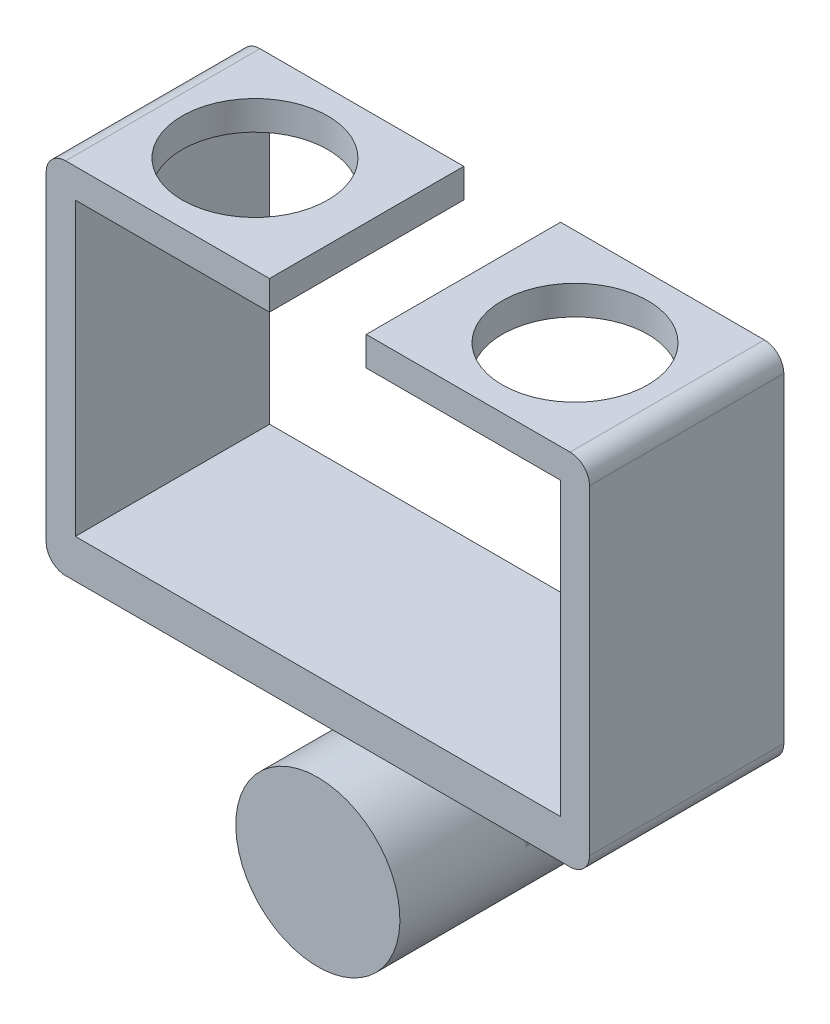
ISO-10303-21;
HEADER;
FILE_DESCRIPTION(('STEP AP214'),'2;1');
FILE_NAME('part.step','',(''),(''),'','','');
FILE_SCHEMA(('AUTOMOTIVE_DESIGN { 1 0 10303 214 1 1 1 1 }'));
ENDSEC;
DATA;
#1=APPLICATION_CONTEXT('core data for automotive mechanical design processes');
#2=APPLICATION_PROTOCOL_DEFINITION('international standard','automotive_design',2000,#1);
#3=PRODUCT_CONTEXT('',#1,'mechanical');
#4=PRODUCT('Part','Part','',(#3));
#5=PRODUCT_RELATED_PRODUCT_CATEGORY('part','',(#4));
#6=PRODUCT_DEFINITION_FORMATION('','',#4);
#7=PRODUCT_DEFINITION_CONTEXT('part definition',#1,'design');
#8=PRODUCT_DEFINITION('design','',#6,#7);
#9=PRODUCT_DEFINITION_SHAPE('','',#8);
#10=(LENGTH_UNIT() NAMED_UNIT(*) SI_UNIT(.MILLI.,.METRE.));
#11=(NAMED_UNIT(*) PLANE_ANGLE_UNIT() SI_UNIT($,.RADIAN.));
#12=(NAMED_UNIT(*) SI_UNIT($,.STERADIAN.) SOLID_ANGLE_UNIT());
#13=UNCERTAINTY_MEASURE_WITH_UNIT(LENGTH_MEASURE(1.E-05),#10,'distance_accuracy_value','');
#14=(GEOMETRIC_REPRESENTATION_CONTEXT(3) GLOBAL_UNCERTAINTY_ASSIGNED_CONTEXT((#13)) GLOBAL_UNIT_ASSIGNED_CONTEXT((#10,
#11,#12)) REPRESENTATION_CONTEXT('',''));
#15=CARTESIAN_POINT('',(0.,0.,0.));
#16=DIRECTION('',(0.,0.,1.));
#17=DIRECTION('',(1.,0.,0.));
#18=AXIS2_PLACEMENT_3D('',#15,#16,#17);
#19=CARTESIAN_POINT('',(0.,0.,25.4));
#20=DIRECTION('',(0.,0.,-1.));
#21=DIRECTION('',(-1.,0.,0.));
#22=AXIS2_PLACEMENT_3D('',#19,#20,#21);
#23=CYLINDRICAL_SURFACE('',#22,10.7286789250919);
#24=CARTESIAN_POINT('',(0.,0.,8.89));
#25=DIRECTION('',(0.,0.,-1.));
#26=DIRECTION('',(-1.,0.,0.));
#27=AXIS2_PLACEMENT_3D('',#24,#25,#26);
#28=CIRCLE('',#27,10.7286789250919);
#29=CARTESIAN_POINT('',(0.,10.7286789250919,8.89));
#30=VERTEX_POINT('',#29);
#31=CARTESIAN_POINT('',(-10.7286789250919,0.,8.89));
#32=VERTEX_POINT('',#31);
#33=EDGE_CURVE('E324',#30,#32,#28,.F.);
#34=ORIENTED_EDGE('',*,*,#33,.T.);
#35=DIRECTION('',(0.,0.,-1.));
#36=VECTOR('',#35,1.);
#37=CARTESIAN_POINT('',(-10.7286789250919,0.,0.));
#38=LINE('',#37,#36);
#39=CARTESIAN_POINT('',(-10.7286789250919,0.,0.));
#40=VERTEX_POINT('',#39);
#41=EDGE_CURVE('E267',#32,#40,#38,.T.);
#42=ORIENTED_EDGE('',*,*,#41,.T.);
#43=CARTESIAN_POINT('',(0.,0.,0.));
#44=DIRECTION('',(0.,0.,1.));
#45=DIRECTION('',(1.,0.,0.));
#46=AXIS2_PLACEMENT_3D('',#43,#44,#45);
#47=CIRCLE('',#46,10.7286789250919);
#48=CARTESIAN_POINT('',(10.7286789250919,0.,0.));
#49=VERTEX_POINT('',#48);
#50=EDGE_CURVE('E304',#40,#49,#47,.T.);
#51=ORIENTED_EDGE('',*,*,#50,.T.);
#52=DIRECTION('',(0.,0.,1.));
#53=VECTOR('',#52,1.);
#54=CARTESIAN_POINT('',(10.7286789250919,0.,0.));
#55=LINE('',#54,#53);
#56=CARTESIAN_POINT('',(10.7286789250919,0.,8.89));
#57=VERTEX_POINT('',#56);
#58=EDGE_CURVE('E293',#49,#57,#55,.T.);
#59=ORIENTED_EDGE('',*,*,#58,.T.);
#60=CARTESIAN_POINT('',(0.,0.,8.89));
#61=DIRECTION('',(0.,0.,-1.));
#62=DIRECTION('',(-1.,0.,0.));
#63=AXIS2_PLACEMENT_3D('',#60,#61,#62);
#64=CIRCLE('',#63,10.7286789250919);
#65=EDGE_CURVE('E322',#57,#30,#64,.F.);
#66=ORIENTED_EDGE('',*,*,#65,.T.);
#67=DIRECTION('',(0.,0.,-1.));
#68=VECTOR('',#67,1.);
#69=CARTESIAN_POINT('',(0.,10.7286789250919,25.4));
#70=LINE('',#69,#68);
#71=CARTESIAN_POINT('',(0.,10.7286789250919,25.4));
#72=VERTEX_POINT('',#71);
#73=EDGE_CURVE('E307',#72,#30,#70,.T.);
#74=ORIENTED_EDGE('',*,*,#73,.F.);
#75=CARTESIAN_POINT('',(0.,0.,25.4));
#76=DIRECTION('',(0.,0.,1.));
#77=DIRECTION('',(1.,0.,0.));
#78=AXIS2_PLACEMENT_3D('',#75,#76,#77);
#79=CIRCLE('',#78,10.7286789250919);
#80=EDGE_CURVE('E306',#72,#72,#79,.T.);
#81=ORIENTED_EDGE('',*,*,#80,.F.);
#82=ORIENTED_EDGE('',*,*,#73,.T.);
#83=EDGE_LOOP('',(#34,#42,#51,#59,#66,#74,#81,#82));
#84=FACE_BOUND('',#83,.T.);
#85=ADVANCED_FACE('F47',(#84),#23,.T.);
#86=CARTESIAN_POINT('',(0.,0.,25.4));
#87=DIRECTION('',(0.,0.,1.));
#88=DIRECTION('',(1.,0.,0.));
#89=AXIS2_PLACEMENT_3D('',#86,#87,#88);
#90=PLANE('',#89);
#91=ORIENTED_EDGE('',*,*,#80,.T.);
#92=EDGE_LOOP('',(#91));
#93=FACE_BOUND('',#92,.T.);
#94=ADVANCED_FACE('F399',(#93),#90,.T.);
#95=CARTESIAN_POINT('',(0.,0.,0.));
#96=DIRECTION('',(0.,0.,1.));
#97=DIRECTION('',(1.,0.,0.));
#98=AXIS2_PLACEMENT_3D('',#95,#96,#97);
#99=PLANE('',#98);
#100=DIRECTION('',(0.,1.,0.));
#101=VECTOR('',#100,1.);
#102=CARTESIAN_POINT('',(35.51174,17.0688,0.));
#103=LINE('',#102,#101);
#104=CARTESIAN_POINT('',(35.51174,19.6088,0.));
#105=VERTEX_POINT('',#104);
#106=CARTESIAN_POINT('',(35.51174,61.4934,0.));
#107=VERTEX_POINT('',#106);
#108=EDGE_CURVE('E259',#105,#107,#103,.T.);
#109=ORIENTED_EDGE('',*,*,#108,.F.);
#110=CARTESIAN_POINT('',(32.97174,19.6088,0.));
#111=DIRECTION('',(0.,0.,1.));
#112=DIRECTION('',(1.,0.,0.));
#113=AXIS2_PLACEMENT_3D('',#110,#111,#112);
#114=CIRCLE('',#113,2.54);
#115=CARTESIAN_POINT('',(32.97174,17.0688,0.));
#116=VERTEX_POINT('',#115);
#117=EDGE_CURVE('E337',#105,#116,#114,.F.);
#118=ORIENTED_EDGE('',*,*,#117,.T.);
#119=DIRECTION('',(1.,0.,0.));
#120=VECTOR('',#119,1.);
#121=CARTESIAN_POINT('',(-35.51174,17.0688,0.));
#122=LINE('',#121,#120);
#123=CARTESIAN_POINT('',(13.2686789250919,17.0688,0.));
#124=VERTEX_POINT('',#123);
#125=EDGE_CURVE('E262',#124,#116,#122,.T.);
#126=ORIENTED_EDGE('',*,*,#125,.F.);
#127=CARTESIAN_POINT('',(13.2686789250919,14.5288,0.));
#128=DIRECTION('',(0.,0.,1.));
#129=DIRECTION('',(1.,0.,0.));
#130=AXIS2_PLACEMENT_3D('',#127,#128,#129);
#131=CIRCLE('',#130,2.54);
#132=CARTESIAN_POINT('',(10.7286789250919,14.5288,0.));
#133=VERTEX_POINT('',#132);
#134=EDGE_CURVE('E59',#124,#133,#131,.T.);
#135=ORIENTED_EDGE('',*,*,#134,.T.);
#136=DIRECTION('',(0.,1.,0.));
#137=VECTOR('',#136,1.);
#138=CARTESIAN_POINT('',(10.7286789250919,0.,0.));
#139=LINE('',#138,#137);
#140=EDGE_CURVE('E299',#49,#133,#139,.T.);
#141=ORIENTED_EDGE('',*,*,#140,.F.);
#142=ORIENTED_EDGE('',*,*,#50,.F.);
#143=DIRECTION('',(0.,1.,0.));
#144=VECTOR('',#143,1.);
#145=CARTESIAN_POINT('',(-10.7286789250919,0.,0.));
#146=LINE('',#145,#144);
#147=CARTESIAN_POINT('',(-10.7286789250919,14.5288,0.));
#148=VERTEX_POINT('',#147);
#149=EDGE_CURVE('E305',#40,#148,#146,.T.);
#150=ORIENTED_EDGE('',*,*,#149,.T.);
#151=CARTESIAN_POINT('',(-13.2686789250919,14.5288,0.));
#152=DIRECTION('',(0.,0.,1.));
#153=DIRECTION('',(1.,0.,0.));
#154=AXIS2_PLACEMENT_3D('',#151,#152,#153);
#155=CIRCLE('',#154,2.54);
#156=CARTESIAN_POINT('',(-13.2686789250919,17.0688,0.));
#157=VERTEX_POINT('',#156);
#158=EDGE_CURVE('E11',#148,#157,#155,.T.);
#159=ORIENTED_EDGE('',*,*,#158,.T.);
#160=CARTESIAN_POINT('',(-32.97174,17.0688,0.));
#161=VERTEX_POINT('',#160);
#162=EDGE_CURVE('E261',#161,#157,#122,.T.);
#163=ORIENTED_EDGE('',*,*,#162,.F.);
#164=CARTESIAN_POINT('',(-32.97174,19.6088,0.));
#165=DIRECTION('',(0.,0.,1.));
#166=DIRECTION('',(1.,0.,0.));
#167=AXIS2_PLACEMENT_3D('',#164,#165,#166);
#168=CIRCLE('',#167,2.54);
#169=CARTESIAN_POINT('',(-35.51174,19.6088,0.));
#170=VERTEX_POINT('',#169);
#171=EDGE_CURVE('E333',#161,#170,#168,.F.);
#172=ORIENTED_EDGE('',*,*,#171,.T.);
#173=DIRECTION('',(0.,-1.,0.));
#174=VECTOR('',#173,1.);
#175=CARTESIAN_POINT('',(-35.51174,64.0334,0.));
#176=LINE('',#175,#174);
#177=CARTESIAN_POINT('',(-35.51174,61.4934,0.));
#178=VERTEX_POINT('',#177);
#179=EDGE_CURVE('E263',#178,#170,#176,.T.);
#180=ORIENTED_EDGE('',*,*,#179,.F.);
#181=CARTESIAN_POINT('',(-32.97174,61.4934,0.));
#182=DIRECTION('',(0.,0.,1.));
#183=DIRECTION('',(1.,0.,0.));
#184=AXIS2_PLACEMENT_3D('',#181,#182,#183);
#185=CIRCLE('',#184,2.54);
#186=CARTESIAN_POINT('',(-32.97174,64.0334,0.));
#187=VERTEX_POINT('',#186);
#188=EDGE_CURVE('E240',#178,#187,#185,.F.);
#189=ORIENTED_EDGE('',*,*,#188,.T.);
#190=DIRECTION('',(-1.,0.,0.));
#191=VECTOR('',#190,1.);
#192=CARTESIAN_POINT('',(-6.32459999999997,64.0334,0.));
#193=LINE('',#192,#191);
#194=CARTESIAN_POINT('',(-6.32459999999997,64.0334,0.));
#195=VERTEX_POINT('',#194);
#196=EDGE_CURVE('E230',#195,#187,#193,.T.);
#197=ORIENTED_EDGE('',*,*,#196,.F.);
#198=DIRECTION('',(0.,1.,0.));
#199=VECTOR('',#198,1.);
#200=CARTESIAN_POINT('',(-6.32459999999999,60.2234,0.));
#201=LINE('',#200,#199);
#202=CARTESIAN_POINT('',(-6.32459999999999,60.2234,0.));
#203=VERTEX_POINT('',#202);
#204=EDGE_CURVE('E219',#203,#195,#201,.T.);
#205=ORIENTED_EDGE('',*,*,#204,.F.);
#206=DIRECTION('',(1.,0.,0.));
#207=VECTOR('',#206,1.);
#208=CARTESIAN_POINT('',(-31.70428,60.2234,0.));
#209=LINE('',#208,#207);
#210=CARTESIAN_POINT('',(-31.70428,60.2234,0.));
#211=VERTEX_POINT('',#210);
#212=EDGE_CURVE('E226',#211,#203,#209,.T.);
#213=ORIENTED_EDGE('',*,*,#212,.F.);
#214=DIRECTION('',(0.,1.,0.));
#215=VECTOR('',#214,1.);
#216=CARTESIAN_POINT('',(-31.70428,22.1488,0.));
#217=LINE('',#216,#215);
#218=CARTESIAN_POINT('',(-31.70428,22.1488,0.));
#219=VERTEX_POINT('',#218);
#220=EDGE_CURVE('E246',#219,#211,#217,.T.);
#221=ORIENTED_EDGE('',*,*,#220,.F.);
#222=DIRECTION('',(-1.,0.,0.));
#223=VECTOR('',#222,1.);
#224=CARTESIAN_POINT('',(31.70428,22.1488,0.));
#225=LINE('',#224,#223);
#226=CARTESIAN_POINT('',(31.70428,22.1488,0.));
#227=VERTEX_POINT('',#226);
#228=EDGE_CURVE('E247',#227,#219,#225,.T.);
#229=ORIENTED_EDGE('',*,*,#228,.F.);
#230=DIRECTION('',(0.,-1.,0.));
#231=VECTOR('',#230,1.);
#232=CARTESIAN_POINT('',(31.70428,60.2234,0.));
#233=LINE('',#232,#231);
#234=CARTESIAN_POINT('',(31.70428,60.2234,0.));
#235=VERTEX_POINT('',#234);
#236=EDGE_CURVE('E249',#235,#227,#233,.T.);
#237=ORIENTED_EDGE('',*,*,#236,.F.);
#238=DIRECTION('',(1.,0.,0.));
#239=VECTOR('',#238,1.);
#240=CARTESIAN_POINT('',(6.32459999999999,60.2234,0.));
#241=LINE('',#240,#239);
#242=CARTESIAN_POINT('',(6.32459999999999,60.2234,0.));
#243=VERTEX_POINT('',#242);
#244=EDGE_CURVE('E255',#243,#235,#241,.T.);
#245=ORIENTED_EDGE('',*,*,#244,.F.);
#246=DIRECTION('',(0.,-1.,0.));
#247=VECTOR('',#246,1.);
#248=CARTESIAN_POINT('',(6.32459999999999,64.0334,0.));
#249=LINE('',#248,#247);
#250=CARTESIAN_POINT('',(6.32459999999999,64.0334,0.));
#251=VERTEX_POINT('',#250);
#252=EDGE_CURVE('E251',#251,#243,#249,.T.);
#253=ORIENTED_EDGE('',*,*,#252,.F.);
#254=DIRECTION('',(-1.,0.,0.));
#255=VECTOR('',#254,1.);
#256=CARTESIAN_POINT('',(35.51174,64.0334,0.));
#257=LINE('',#256,#255);
#258=CARTESIAN_POINT('',(32.97174,64.0334,0.));
#259=VERTEX_POINT('',#258);
#260=EDGE_CURVE('E257',#259,#251,#257,.T.);
#261=ORIENTED_EDGE('',*,*,#260,.F.);
#262=CARTESIAN_POINT('',(32.97174,61.4934,0.));
#263=DIRECTION('',(0.,0.,1.));
#264=DIRECTION('',(1.,0.,0.));
#265=AXIS2_PLACEMENT_3D('',#262,#263,#264);
#266=CIRCLE('',#265,2.54);
#267=EDGE_CURVE('E335',#259,#107,#266,.F.);
#268=ORIENTED_EDGE('',*,*,#267,.T.);
#269=EDGE_LOOP('',(#109,#118,#126,#135,#141,#142,#150,#159,#163,#172,#180,#189,#197,#205,#213,
#221,#229,#237,#245,#253,#261,#268));
#270=FACE_BOUND('',#269,.T.);
#271=ADVANCED_FACE('F232',(#270),#99,.F.);
#272=CARTESIAN_POINT('',(-10.7286789250919,0.,0.));
#273=DIRECTION('',(1.,0.,0.));
#274=DIRECTION('',(0.,0.,-1.));
#275=AXIS2_PLACEMENT_3D('',#272,#273,#274);
#276=PLANE('',#275);
#277=DIRECTION('',(0.,1.,0.));
#278=VECTOR('',#277,1.);
#279=CARTESIAN_POINT('',(-10.7286789250919,0.,6.35));
#280=LINE('',#279,#278);
#281=CARTESIAN_POINT('',(-10.7286789250919,7.80725873399025,6.35));
#282=VERTEX_POINT('',#281);
#283=CARTESIAN_POINT('',(-10.7286789250919,14.5288,6.35));
#284=VERTEX_POINT('',#283);
#285=EDGE_CURVE('E291',#282,#284,#280,.T.);
#286=ORIENTED_EDGE('',*,*,#285,.T.);
#287=DIRECTION('',(0.,0.,-1.));
#288=VECTOR('',#287,1.);
#289=CARTESIAN_POINT('',(-10.7286789250919,14.5288,0.));
#290=LINE('',#289,#288);
#291=EDGE_CURVE('E368',#284,#148,#290,.T.);
#292=ORIENTED_EDGE('',*,*,#291,.T.);
#293=ORIENTED_EDGE('',*,*,#149,.F.);
#294=ORIENTED_EDGE('',*,*,#41,.F.);
#295=CARTESIAN_POINT('',(-10.7286789250919,7.80725873399025,6.35));
#296=CARTESIAN_POINT('',(-10.7286789250919,7.66761417603446,6.35001430530166));
#297=CARTESIAN_POINT('',(-10.7286789250919,7.52801212278884,6.35398606043129));
#298=CARTESIAN_POINT('',(-10.7286789250919,7.24927147018638,6.36910692379827));
#299=CARTESIAN_POINT('',(-10.7286789250919,7.1101326508242,6.3802519114397));
#300=CARTESIAN_POINT('',(-10.7286789250919,6.83294130777135,6.40894143804099));
#301=CARTESIAN_POINT('',(-10.7286789250919,6.69488679828733,6.4264671914283));
#302=CARTESIAN_POINT('',(-10.7286789250919,6.41962320291789,6.46729207649686));
#303=CARTESIAN_POINT('',(-10.7286789250919,6.28241425397685,6.49059211942217));
#304=CARTESIAN_POINT('',(-10.7286789250919,5.87572665014559,6.56761735927422));
#305=CARTESIAN_POINT('',(-10.7286789250919,5.60765751641874,6.62886432992143));
#306=CARTESIAN_POINT('',(-10.7286789250919,5.07566872524186,6.76774833388559));
#307=CARTESIAN_POINT('',(-10.7286789250919,4.81175282172299,6.84539937184912));
#308=CARTESIAN_POINT('',(-10.7286789250919,4.15895605614699,7.05536352961953));
#309=CARTESIAN_POINT('',(-10.7286789250919,3.77268409203444,7.19574035946397));
#310=CARTESIAN_POINT('',(-10.7286789250919,3.00826697151438,7.49671123609007));
#311=CARTESIAN_POINT('',(-10.7286789250919,2.6301224771428,7.65730692257882));
#312=CARTESIAN_POINT('',(-10.7286789250919,1.50160091482876,8.15941865561663));
#313=CARTESIAN_POINT('',(-10.7286789250919,0.759971296855209,8.52022253189779));
#314=CARTESIAN_POINT('',(-10.7286789250919,0.012418544039837,8.88395754578172));
#315=CARTESIAN_POINT('',(-10.7286789250919,0.00620926531647968,8.88697878361511));
#316=CARTESIAN_POINT('',(-10.7286789250919,0.,8.89));
#317=B_SPLINE_CURVE_WITH_KNOTS('',3,(#295,#296,#297,#298,#299,#300,#301,#302,#303,#304,#305,
#306,#307,#308,#309,#310,#311,#312,#313,#314,#315,#316),.UNSPECIFIED.,.F.,.F.,(4,2,2,2,2,2,2,2,
2,2,4),(0.,0.418816198065689,0.837392025571224,1.25474536198528,1.67216460316429,
2.4963769217861,3.32129575969246,4.5533390204244,5.78548226173326,8.25880060212139,
8.27951646939769),.UNSPECIFIED.);
#318=EDGE_CURVE('E369',#32,#282,#317,.F.);
#319=ORIENTED_EDGE('',*,*,#318,.T.);
#320=EDGE_LOOP('',(#286,#292,#293,#294,#319));
#321=FACE_BOUND('',#320,.T.);
#322=ADVANCED_FACE('F386',(#321),#276,.F.);
#323=CARTESIAN_POINT('',(10.7286789250919,0.,0.));
#324=DIRECTION('',(-1.,0.,0.));
#325=DIRECTION('',(0.,0.,1.));
#326=AXIS2_PLACEMENT_3D('',#323,#324,#325);
#327=PLANE('',#326);
#328=ORIENTED_EDGE('',*,*,#140,.T.);
#329=DIRECTION('',(0.,0.,1.));
#330=VECTOR('',#329,1.);
#331=CARTESIAN_POINT('',(10.7286789250919,14.5288,6.35));
#332=LINE('',#331,#330);
#333=CARTESIAN_POINT('',(10.7286789250919,14.5288,6.35));
#334=VERTEX_POINT('',#333);
#335=EDGE_CURVE('E362',#133,#334,#332,.T.);
#336=ORIENTED_EDGE('',*,*,#335,.T.);
#337=DIRECTION('',(0.,1.,0.));
#338=VECTOR('',#337,1.);
#339=CARTESIAN_POINT('',(10.7286789250919,0.,6.35));
#340=LINE('',#339,#338);
#341=CARTESIAN_POINT('',(10.7286789250919,7.80725873399025,6.35));
#342=VERTEX_POINT('',#341);
#343=EDGE_CURVE('E298',#342,#334,#340,.T.);
#344=ORIENTED_EDGE('',*,*,#343,.F.);
#345=CARTESIAN_POINT('',(10.7286789250919,7.80725873399025,6.35));
#346=CARTESIAN_POINT('',(10.7286789250919,7.66761417603446,6.35001430530166));
#347=CARTESIAN_POINT('',(10.7286789250919,7.52801212278884,6.35398606043129));
#348=CARTESIAN_POINT('',(10.7286789250919,7.24927147018638,6.36910692379827));
#349=CARTESIAN_POINT('',(10.7286789250919,7.1101326508242,6.3802519114397));
#350=CARTESIAN_POINT('',(10.7286789250919,6.83294130777135,6.40894143804099));
#351=CARTESIAN_POINT('',(10.7286789250919,6.69488679828733,6.4264671914283));
#352=CARTESIAN_POINT('',(10.7286789250919,6.41962320291789,6.46729207649686));
#353=CARTESIAN_POINT('',(10.7286789250919,6.28241425397685,6.49059211942217));
#354=CARTESIAN_POINT('',(10.7286789250919,5.87572665014559,6.56761735927422));
#355=CARTESIAN_POINT('',(10.7286789250919,5.60765751641874,6.62886432992143));
#356=CARTESIAN_POINT('',(10.7286789250919,5.07566872524186,6.76774833388559));
#357=CARTESIAN_POINT('',(10.7286789250919,4.81175282172299,6.84539937184912));
#358=CARTESIAN_POINT('',(10.7286789250919,4.15895605614699,7.05536352961953));
#359=CARTESIAN_POINT('',(10.7286789250919,3.77268409203444,7.19574035946397));
#360=CARTESIAN_POINT('',(10.7286789250919,3.00826697151438,7.49671123609007));
#361=CARTESIAN_POINT('',(10.7286789250919,2.6301224771428,7.65730692257882));
#362=CARTESIAN_POINT('',(10.7286789250919,1.50160091482876,8.15941865561663));
#363=CARTESIAN_POINT('',(10.7286789250919,0.759971296855209,8.52022253189779));
#364=CARTESIAN_POINT('',(10.7286789250919,0.012418544039837,8.88395754578172));
#365=CARTESIAN_POINT('',(10.7286789250919,0.00620926531647968,8.88697878361511));
#366=CARTESIAN_POINT('',(10.7286789250919,0.,8.89));
#367=B_SPLINE_CURVE_WITH_KNOTS('',3,(#345,#346,#347,#348,#349,#350,#351,#352,#353,#354,#355,
#356,#357,#358,#359,#360,#361,#362,#363,#364,#365,#366),.UNSPECIFIED.,.F.,.F.,(4,2,2,2,2,2,2,2,
2,2,4),(0.,0.418816198065689,0.837392025571224,1.25474536198528,1.67216460316429,
2.4963769217861,3.32129575969246,4.5533390204244,5.78548226173326,8.25880060212139,
8.27951646939769),.UNSPECIFIED.);
#368=EDGE_CURVE('E377',#342,#57,#367,.T.);
#369=ORIENTED_EDGE('',*,*,#368,.T.);
#370=ORIENTED_EDGE('',*,*,#58,.F.);
#371=EDGE_LOOP('',(#328,#336,#344,#369,#370));
#372=FACE_BOUND('',#371,.T.);
#373=ADVANCED_FACE('F394',(#372),#327,.F.);
#374=CARTESIAN_POINT('',(-10.7286789250919,0.,6.35));
#375=DIRECTION('',(0.,0.,-1.));
#376=DIRECTION('',(-1.,0.,0.));
#377=AXIS2_PLACEMENT_3D('',#374,#375,#376);
#378=PLANE('',#377);
#379=ORIENTED_EDGE('',*,*,#285,.F.);
#380=CARTESIAN_POINT('',(0.,0.,6.35));
#381=DIRECTION('',(0.,0.,-1.));
#382=DIRECTION('',(-1.,0.,0.));
#383=AXIS2_PLACEMENT_3D('',#380,#381,#382);
#384=CIRCLE('',#383,13.2686789250919);
#385=CARTESIAN_POINT('',(0.,13.2686789250919,6.35));
#386=VERTEX_POINT('',#385);
#387=EDGE_CURVE('E319',#282,#386,#384,.T.);
#388=ORIENTED_EDGE('',*,*,#387,.T.);
#389=CARTESIAN_POINT('',(0.,0.,6.35));
#390=DIRECTION('',(0.,0.,-1.));
#391=DIRECTION('',(-1.,0.,0.));
#392=AXIS2_PLACEMENT_3D('',#389,#390,#391);
#393=CIRCLE('',#392,13.2686789250919);
#394=EDGE_CURVE('E317',#386,#342,#393,.T.);
#395=ORIENTED_EDGE('',*,*,#394,.T.);
#396=ORIENTED_EDGE('',*,*,#343,.T.);
#397=DIRECTION('',(-1.,0.,0.));
#398=VECTOR('',#397,1.);
#399=CARTESIAN_POINT('',(-10.7286789250919,14.5288,6.35));
#400=LINE('',#399,#398);
#401=EDGE_CURVE('E313',#334,#284,#400,.T.);
#402=ORIENTED_EDGE('',*,*,#401,.T.);
#403=EDGE_LOOP('',(#379,#388,#395,#396,#402));
#404=FACE_BOUND('',#403,.T.);
#405=ADVANCED_FACE('F419',(#404),#378,.F.);
#406=CARTESIAN_POINT('',(-35.51174,64.0334,25.4));
#407=DIRECTION('',(1.,0.,0.));
#408=DIRECTION('',(0.,1.,0.));
#409=AXIS2_PLACEMENT_3D('',#406,#407,#408);
#410=PLANE('',#409);
#411=DIRECTION('',(0.,-1.,0.));
#412=VECTOR('',#411,1.);
#413=CARTESIAN_POINT('',(-35.51174,64.0334,25.4));
#414=LINE('',#413,#412);
#415=CARTESIAN_POINT('',(-35.51174,61.4934,25.4));
#416=VERTEX_POINT('',#415);
#417=CARTESIAN_POINT('',(-35.51174,19.6088,25.4));
#418=VERTEX_POINT('',#417);
#419=EDGE_CURVE('E238',#416,#418,#414,.T.);
#420=ORIENTED_EDGE('',*,*,#419,.F.);
#421=DIRECTION('',(0.,0.,-1.));
#422=VECTOR('',#421,1.);
#423=CARTESIAN_POINT('',(-35.51174,61.4934,25.4));
#424=LINE('',#423,#422);
#425=EDGE_CURVE('E363',#416,#178,#424,.T.);
#426=ORIENTED_EDGE('',*,*,#425,.T.);
#427=ORIENTED_EDGE('',*,*,#179,.T.);
#428=DIRECTION('',(0.,0.,-1.));
#429=VECTOR('',#428,1.);
#430=CARTESIAN_POINT('',(-35.51174,19.6088,25.4));
#431=LINE('',#430,#429);
#432=EDGE_CURVE('E360',#170,#418,#431,.F.);
#433=ORIENTED_EDGE('',*,*,#432,.T.);
#434=EDGE_LOOP('',(#420,#426,#427,#433));
#435=FACE_BOUND('',#434,.T.);
#436=ADVANCED_FACE('F458',(#435),#410,.F.);
#437=CARTESIAN_POINT('',(-35.51174,17.0688,25.4));
#438=DIRECTION('',(0.,1.,0.));
#439=DIRECTION('',(-1.,0.,0.));
#440=AXIS2_PLACEMENT_3D('',#437,#438,#439);
#441=PLANE('',#440);
#442=ORIENTED_EDGE('',*,*,#125,.T.);
#443=DIRECTION('',(0.,0.,-1.));
#444=VECTOR('',#443,1.);
#445=CARTESIAN_POINT('',(32.97174,17.0688,25.4));
#446=LINE('',#445,#444);
#447=CARTESIAN_POINT('',(32.97174,17.0688,25.4));
#448=VERTEX_POINT('',#447);
#449=EDGE_CURVE('E350',#116,#448,#446,.F.);
#450=ORIENTED_EDGE('',*,*,#449,.T.);
#451=DIRECTION('',(1.,0.,0.));
#452=VECTOR('',#451,1.);
#453=CARTESIAN_POINT('',(-35.51174,17.0688,25.4));
#454=LINE('',#453,#452);
#455=CARTESIAN_POINT('',(-32.97174,17.0688,25.4));
#456=VERTEX_POINT('',#455);
#457=EDGE_CURVE('E241',#456,#448,#454,.T.);
#458=ORIENTED_EDGE('',*,*,#457,.F.);
#459=DIRECTION('',(0.,0.,-1.));
#460=VECTOR('',#459,1.);
#461=CARTESIAN_POINT('',(-32.97174,17.0688,25.4));
#462=LINE('',#461,#460);
#463=EDGE_CURVE('E341',#456,#161,#462,.T.);
#464=ORIENTED_EDGE('',*,*,#463,.T.);
#465=ORIENTED_EDGE('',*,*,#162,.T.);
#466=DIRECTION('',(0.,0.,-1.));
#467=VECTOR('',#466,1.);
#468=CARTESIAN_POINT('',(-13.2686789250919,17.0688,6.35));
#469=LINE('',#468,#467);
#470=CARTESIAN_POINT('',(-13.2686789250919,17.0688,8.89));
#471=VERTEX_POINT('',#470);
#472=EDGE_CURVE('E338',#157,#471,#469,.F.);
#473=ORIENTED_EDGE('',*,*,#472,.T.);
#474=DIRECTION('',(-1.,0.,0.));
#475=VECTOR('',#474,1.);
#476=CARTESIAN_POINT('',(10.7286789250919,17.0688,8.89));
#477=LINE('',#476,#475);
#478=CARTESIAN_POINT('',(13.2686789250919,17.0688,8.89));
#479=VERTEX_POINT('',#478);
#480=EDGE_CURVE('E336',#471,#479,#477,.F.);
#481=ORIENTED_EDGE('',*,*,#480,.T.);
#482=DIRECTION('',(0.,0.,1.));
#483=VECTOR('',#482,1.);
#484=CARTESIAN_POINT('',(13.2686789250919,17.0688,0.));
#485=LINE('',#484,#483);
#486=EDGE_CURVE('E345',#479,#124,#485,.F.);
#487=ORIENTED_EDGE('',*,*,#486,.T.);
#488=EDGE_LOOP('',(#442,#450,#458,#464,#465,#473,#481,#487));
#489=FACE_BOUND('',#488,.T.);
#490=ADVANCED_FACE('F452',(#489),#441,.F.);
#491=CARTESIAN_POINT('',(35.51174,17.0688,25.4));
#492=DIRECTION('',(-1.,0.,0.));
#493=DIRECTION('',(0.,-1.,0.));
#494=AXIS2_PLACEMENT_3D('',#491,#492,#493);
#495=PLANE('',#494);
#496=DIRECTION('',(0.,1.,0.));
#497=VECTOR('',#496,1.);
#498=CARTESIAN_POINT('',(35.51174,17.0688,25.4));
#499=LINE('',#498,#497);
#500=CARTESIAN_POINT('',(35.51174,19.6088,25.4));
#501=VERTEX_POINT('',#500);
#502=CARTESIAN_POINT('',(35.51174,61.4934,25.4));
#503=VERTEX_POINT('',#502);
#504=EDGE_CURVE('E288',#501,#503,#499,.T.);
#505=ORIENTED_EDGE('',*,*,#504,.F.);
#506=DIRECTION('',(0.,0.,-1.));
#507=VECTOR('',#506,1.);
#508=CARTESIAN_POINT('',(35.51174,19.6088,25.4));
#509=LINE('',#508,#507);
#510=EDGE_CURVE('E329',#501,#105,#509,.T.);
#511=ORIENTED_EDGE('',*,*,#510,.T.);
#512=ORIENTED_EDGE('',*,*,#108,.T.);
#513=DIRECTION('',(0.,0.,-1.));
#514=VECTOR('',#513,1.);
#515=CARTESIAN_POINT('',(35.51174,61.4934,25.4));
#516=LINE('',#515,#514);
#517=EDGE_CURVE('E327',#107,#503,#516,.F.);
#518=ORIENTED_EDGE('',*,*,#517,.T.);
#519=EDGE_LOOP('',(#505,#511,#512,#518));
#520=FACE_BOUND('',#519,.T.);
#521=ADVANCED_FACE('F508',(#520),#495,.F.);
#522=CARTESIAN_POINT('',(35.51174,64.0334,25.4));
#523=DIRECTION('',(0.,-1.,0.));
#524=DIRECTION('',(0.,0.,-1.));
#525=AXIS2_PLACEMENT_3D('',#522,#523,#524);
#526=PLANE('',#525);
#527=CARTESIAN_POINT('',(20.91817,64.0334,12.7));
#528=DIRECTION('',(0.,1.,0.));
#529=DIRECTION('',(0.,0.,1.));
#530=AXIS2_PLACEMENT_3D('',#527,#528,#529);
#531=CIRCLE('',#530,9.525);
#532=CARTESIAN_POINT('',(20.91817,64.0334,22.225));
#533=VERTEX_POINT('',#532);
#534=EDGE_CURVE('E494',#533,#533,#531,.T.);
#535=ORIENTED_EDGE('',*,*,#534,.F.);
#536=EDGE_LOOP('',(#535));
#537=FACE_BOUND('',#536,.T.);
#538=DIRECTION('',(-1.,0.,0.));
#539=VECTOR('',#538,1.);
#540=CARTESIAN_POINT('',(35.51174,64.0334,25.4));
#541=LINE('',#540,#539);
#542=CARTESIAN_POINT('',(32.97174,64.0334,25.4));
#543=VERTEX_POINT('',#542);
#544=CARTESIAN_POINT('',(6.32459999999999,64.0334,25.4));
#545=VERTEX_POINT('',#544);
#546=EDGE_CURVE('E281',#543,#545,#541,.T.);
#547=ORIENTED_EDGE('',*,*,#546,.F.);
#548=DIRECTION('',(0.,0.,-1.));
#549=VECTOR('',#548,1.);
#550=CARTESIAN_POINT('',(32.97174,64.0334,25.4));
#551=LINE('',#550,#549);
#552=EDGE_CURVE('E358',#543,#259,#551,.T.);
#553=ORIENTED_EDGE('',*,*,#552,.T.);
#554=ORIENTED_EDGE('',*,*,#260,.T.);
#555=DIRECTION('',(0.,0.,-1.));
#556=VECTOR('',#555,1.);
#557=CARTESIAN_POINT('',(6.32459999999999,64.0334,25.4));
#558=LINE('',#557,#556);
#559=EDGE_CURVE('E487',#545,#251,#558,.T.);
#560=ORIENTED_EDGE('',*,*,#559,.F.);
#561=EDGE_LOOP('',(#547,#553,#554,#560));
#562=FACE_BOUND('',#561,.T.);
#563=ADVANCED_FACE('F504',(#537,#562),#526,.F.);
#564=CARTESIAN_POINT('',(6.32459999999999,64.0334,25.4));
#565=DIRECTION('',(1.,0.,0.));
#566=DIRECTION('',(0.,1.,0.));
#567=AXIS2_PLACEMENT_3D('',#564,#565,#566);
#568=PLANE('',#567);
#569=ORIENTED_EDGE('',*,*,#252,.T.);
#570=DIRECTION('',(0.,0.,-1.));
#571=VECTOR('',#570,1.);
#572=CARTESIAN_POINT('',(6.32459999999999,60.2234,25.4));
#573=LINE('',#572,#571);
#574=CARTESIAN_POINT('',(6.32459999999999,60.2234,25.4));
#575=VERTEX_POINT('',#574);
#576=EDGE_CURVE('E485',#575,#243,#573,.T.);
#577=ORIENTED_EDGE('',*,*,#576,.F.);
#578=DIRECTION('',(0.,-1.,0.));
#579=VECTOR('',#578,1.);
#580=CARTESIAN_POINT('',(6.32459999999999,64.0334,25.4));
#581=LINE('',#580,#579);
#582=EDGE_CURVE('E285',#545,#575,#581,.T.);
#583=ORIENTED_EDGE('',*,*,#582,.F.);
#584=ORIENTED_EDGE('',*,*,#559,.T.);
#585=EDGE_LOOP('',(#569,#577,#583,#584));
#586=FACE_BOUND('',#585,.T.);
#587=ADVANCED_FACE('F507',(#586),#568,.F.);
#588=CARTESIAN_POINT('',(6.32459999999999,60.2234,25.4));
#589=DIRECTION('',(0.,1.,0.));
#590=DIRECTION('',(0.,0.,1.));
#591=AXIS2_PLACEMENT_3D('',#588,#589,#590);
#592=PLANE('',#591);
#593=CARTESIAN_POINT('',(20.91817,60.2234,12.7));
#594=DIRECTION('',(0.,1.,0.));
#595=DIRECTION('',(0.,0.,1.));
#596=AXIS2_PLACEMENT_3D('',#593,#594,#595);
#597=CIRCLE('',#596,9.525);
#598=CARTESIAN_POINT('',(20.91817,60.2234,22.225));
#599=VERTEX_POINT('',#598);
#600=EDGE_CURVE('E489',#599,#599,#597,.F.);
#601=ORIENTED_EDGE('',*,*,#600,.F.);
#602=EDGE_LOOP('',(#601));
#603=FACE_BOUND('',#602,.T.);
#604=ORIENTED_EDGE('',*,*,#244,.T.);
#605=DIRECTION('',(0.,0.,-1.));
#606=VECTOR('',#605,1.);
#607=CARTESIAN_POINT('',(31.70428,60.2234,25.4));
#608=LINE('',#607,#606);
#609=CARTESIAN_POINT('',(31.70428,60.2234,25.4));
#610=VERTEX_POINT('',#609);
#611=EDGE_CURVE('E483',#610,#235,#608,.T.);
#612=ORIENTED_EDGE('',*,*,#611,.F.);
#613=DIRECTION('',(1.,0.,0.));
#614=VECTOR('',#613,1.);
#615=CARTESIAN_POINT('',(6.32459999999999,60.2234,25.4));
#616=LINE('',#615,#614);
#617=EDGE_CURVE('E278',#575,#610,#616,.T.);
#618=ORIENTED_EDGE('',*,*,#617,.F.);
#619=ORIENTED_EDGE('',*,*,#576,.T.);
#620=EDGE_LOOP('',(#604,#612,#618,#619));
#621=FACE_BOUND('',#620,.T.);
#622=ADVANCED_FACE('F706',(#603,#621),#592,.F.);
#623=CARTESIAN_POINT('',(31.70428,60.2234,25.4));
#624=DIRECTION('',(1.,0.,0.));
#625=DIRECTION('',(0.,1.,0.));
#626=AXIS2_PLACEMENT_3D('',#623,#624,#625);
#627=PLANE('',#626);
#628=ORIENTED_EDGE('',*,*,#236,.T.);
#629=DIRECTION('',(0.,0.,-1.));
#630=VECTOR('',#629,1.);
#631=CARTESIAN_POINT('',(31.70428,22.1488,25.4));
#632=LINE('',#631,#630);
#633=CARTESIAN_POINT('',(31.70428,22.1488,25.4));
#634=VERTEX_POINT('',#633);
#635=EDGE_CURVE('E479',#634,#227,#632,.T.);
#636=ORIENTED_EDGE('',*,*,#635,.F.);
#637=DIRECTION('',(0.,-1.,0.));
#638=VECTOR('',#637,1.);
#639=CARTESIAN_POINT('',(31.70428,60.2234,25.4));
#640=LINE('',#639,#638);
#641=EDGE_CURVE('E279',#610,#634,#640,.T.);
#642=ORIENTED_EDGE('',*,*,#641,.F.);
#643=ORIENTED_EDGE('',*,*,#611,.T.);
#644=EDGE_LOOP('',(#628,#636,#642,#643));
#645=FACE_BOUND('',#644,.T.);
#646=ADVANCED_FACE('F720',(#645),#627,.F.);
#647=CARTESIAN_POINT('',(31.70428,22.1488,25.4));
#648=DIRECTION('',(0.,-1.,0.));
#649=DIRECTION('',(1.,0.,0.));
#650=AXIS2_PLACEMENT_3D('',#647,#648,#649);
#651=PLANE('',#650);
#652=ORIENTED_EDGE('',*,*,#228,.T.);
#653=DIRECTION('',(0.,0.,-1.));
#654=VECTOR('',#653,1.);
#655=CARTESIAN_POINT('',(-31.70428,22.1488,25.4));
#656=LINE('',#655,#654);
#657=CARTESIAN_POINT('',(-31.70428,22.1488,25.4));
#658=VERTEX_POINT('',#657);
#659=EDGE_CURVE('E474',#658,#219,#656,.T.);
#660=ORIENTED_EDGE('',*,*,#659,.F.);
#661=DIRECTION('',(-1.,0.,0.));
#662=VECTOR('',#661,1.);
#663=CARTESIAN_POINT('',(31.70428,22.1488,25.4));
#664=LINE('',#663,#662);
#665=EDGE_CURVE('E277',#634,#658,#664,.T.);
#666=ORIENTED_EDGE('',*,*,#665,.F.);
#667=ORIENTED_EDGE('',*,*,#635,.T.);
#668=EDGE_LOOP('',(#652,#660,#666,#667));
#669=FACE_BOUND('',#668,.T.);
#670=ADVANCED_FACE('F727',(#669),#651,.F.);
#671=CARTESIAN_POINT('',(-31.70428,22.1488,25.4));
#672=DIRECTION('',(-1.,0.,0.));
#673=DIRECTION('',(0.,-1.,0.));
#674=AXIS2_PLACEMENT_3D('',#671,#672,#673);
#675=PLANE('',#674);
#676=ORIENTED_EDGE('',*,*,#220,.T.);
#677=DIRECTION('',(0.,0.,-1.));
#678=VECTOR('',#677,1.);
#679=CARTESIAN_POINT('',(-31.70428,60.2234,25.4));
#680=LINE('',#679,#678);
#681=CARTESIAN_POINT('',(-31.70428,60.2234,25.4));
#682=VERTEX_POINT('',#681);
#683=EDGE_CURVE('E475',#682,#211,#680,.T.);
#684=ORIENTED_EDGE('',*,*,#683,.F.);
#685=DIRECTION('',(0.,1.,0.));
#686=VECTOR('',#685,1.);
#687=CARTESIAN_POINT('',(-31.70428,22.1488,25.4));
#688=LINE('',#687,#686);
#689=EDGE_CURVE('E274',#658,#682,#688,.T.);
#690=ORIENTED_EDGE('',*,*,#689,.F.);
#691=ORIENTED_EDGE('',*,*,#659,.T.);
#692=EDGE_LOOP('',(#676,#684,#690,#691));
#693=FACE_BOUND('',#692,.T.);
#694=ADVANCED_FACE('F733',(#693),#675,.F.);
#695=CARTESIAN_POINT('',(-31.70428,60.2234,25.4));
#696=DIRECTION('',(0.,1.,0.));
#697=DIRECTION('',(-1.,0.,0.));
#698=AXIS2_PLACEMENT_3D('',#695,#696,#697);
#699=PLANE('',#698);
#700=CARTESIAN_POINT('',(-20.91817,60.2234,12.7));
#701=DIRECTION('',(0.,1.,0.));
#702=DIRECTION('',(-1.,0.,0.));
#703=AXIS2_PLACEMENT_3D('',#700,#701,#702);
#704=CIRCLE('',#703,9.525);
#705=CARTESIAN_POINT('',(-30.44317,60.2234,12.7));
#706=VERTEX_POINT('',#705);
#707=EDGE_CURVE('E493',#706,#706,#704,.F.);
#708=ORIENTED_EDGE('',*,*,#707,.F.);
#709=EDGE_LOOP('',(#708));
#710=FACE_BOUND('',#709,.T.);
#711=ORIENTED_EDGE('',*,*,#212,.T.);
#712=DIRECTION('',(0.,0.,-1.));
#713=VECTOR('',#712,1.);
#714=CARTESIAN_POINT('',(-6.32459999999999,60.2234,25.4));
#715=LINE('',#714,#713);
#716=CARTESIAN_POINT('',(-6.32459999999999,60.2234,25.4));
#717=VERTEX_POINT('',#716);
#718=EDGE_CURVE('E225',#717,#203,#715,.T.);
#719=ORIENTED_EDGE('',*,*,#718,.F.);
#720=DIRECTION('',(1.,0.,0.));
#721=VECTOR('',#720,1.);
#722=CARTESIAN_POINT('',(-31.70428,60.2234,25.4));
#723=LINE('',#722,#721);
#724=EDGE_CURVE('E275',#682,#717,#723,.T.);
#725=ORIENTED_EDGE('',*,*,#724,.F.);
#726=ORIENTED_EDGE('',*,*,#683,.T.);
#727=EDGE_LOOP('',(#711,#719,#725,#726));
#728=FACE_BOUND('',#727,.T.);
#729=ADVANCED_FACE('F472',(#710,#728),#699,.F.);
#730=CARTESIAN_POINT('',(-6.32459999999999,60.2234,25.4));
#731=DIRECTION('',(-1.,0.,0.));
#732=DIRECTION('',(0.,-1.,0.));
#733=AXIS2_PLACEMENT_3D('',#730,#731,#732);
#734=PLANE('',#733);
#735=ORIENTED_EDGE('',*,*,#204,.T.);
#736=DIRECTION('',(0.,0.,-1.));
#737=VECTOR('',#736,1.);
#738=CARTESIAN_POINT('',(-6.32459999999997,64.0334,25.4));
#739=LINE('',#738,#737);
#740=CARTESIAN_POINT('',(-6.32459999999997,64.0334,25.4));
#741=VERTEX_POINT('',#740);
#742=EDGE_CURVE('E224',#741,#195,#739,.T.);
#743=ORIENTED_EDGE('',*,*,#742,.F.);
#744=DIRECTION('',(0.,1.,0.));
#745=VECTOR('',#744,1.);
#746=CARTESIAN_POINT('',(-6.32459999999999,60.2234,25.4));
#747=LINE('',#746,#745);
#748=EDGE_CURVE('E266',#717,#741,#747,.T.);
#749=ORIENTED_EDGE('',*,*,#748,.F.);
#750=ORIENTED_EDGE('',*,*,#718,.T.);
#751=EDGE_LOOP('',(#735,#743,#749,#750));
#752=FACE_BOUND('',#751,.T.);
#753=ADVANCED_FACE('F218',(#752),#734,.F.);
#754=CARTESIAN_POINT('',(-6.32459999999997,64.0334,25.4));
#755=DIRECTION('',(0.,-1.,0.));
#756=DIRECTION('',(1.,0.,0.));
#757=AXIS2_PLACEMENT_3D('',#754,#755,#756);
#758=PLANE('',#757);
#759=CARTESIAN_POINT('',(-20.91817,64.0334,12.7));
#760=DIRECTION('',(0.,1.,0.));
#761=DIRECTION('',(0.,0.,1.));
#762=AXIS2_PLACEMENT_3D('',#759,#760,#761);
#763=CIRCLE('',#762,9.525);
#764=CARTESIAN_POINT('',(-20.91817,64.0334,22.225));
#765=VERTEX_POINT('',#764);
#766=EDGE_CURVE('E437',#765,#765,#763,.T.);
#767=ORIENTED_EDGE('',*,*,#766,.F.);
#768=EDGE_LOOP('',(#767));
#769=FACE_BOUND('',#768,.T.);
#770=ORIENTED_EDGE('',*,*,#196,.T.);
#771=DIRECTION('',(0.,0.,-1.));
#772=VECTOR('',#771,1.);
#773=CARTESIAN_POINT('',(-32.97174,64.0334,25.4));
#774=LINE('',#773,#772);
#775=CARTESIAN_POINT('',(-32.97174,64.0334,25.4));
#776=VERTEX_POINT('',#775);
#777=EDGE_CURVE('E67',#187,#776,#774,.F.);
#778=ORIENTED_EDGE('',*,*,#777,.T.);
#779=DIRECTION('',(-1.,0.,0.));
#780=VECTOR('',#779,1.);
#781=CARTESIAN_POINT('',(-6.32459999999997,64.0334,25.4));
#782=LINE('',#781,#780);
#783=EDGE_CURVE('E235',#741,#776,#782,.T.);
#784=ORIENTED_EDGE('',*,*,#783,.F.);
#785=ORIENTED_EDGE('',*,*,#742,.T.);
#786=EDGE_LOOP('',(#770,#778,#784,#785));
#787=FACE_BOUND('',#786,.T.);
#788=ADVANCED_FACE('F233',(#769,#787),#758,.F.);
#789=CARTESIAN_POINT('',(0.,0.,25.4));
#790=DIRECTION('',(0.,0.,1.));
#791=DIRECTION('',(1.,0.,0.));
#792=AXIS2_PLACEMENT_3D('',#789,#790,#791);
#793=PLANE('',#792);
#794=ORIENTED_EDGE('',*,*,#457,.T.);
#795=CARTESIAN_POINT('',(32.97174,19.6088,25.4));
#796=DIRECTION('',(0.,0.,1.));
#797=DIRECTION('',(1.,0.,0.));
#798=AXIS2_PLACEMENT_3D('',#795,#796,#797);
#799=CIRCLE('',#798,2.54);
#800=EDGE_CURVE('E355',#448,#501,#799,.T.);
#801=ORIENTED_EDGE('',*,*,#800,.T.);
#802=ORIENTED_EDGE('',*,*,#504,.T.);
#803=CARTESIAN_POINT('',(32.97174,61.4934,25.4));
#804=DIRECTION('',(0.,0.,1.));
#805=DIRECTION('',(1.,0.,0.));
#806=AXIS2_PLACEMENT_3D('',#803,#804,#805);
#807=CIRCLE('',#806,2.54);
#808=EDGE_CURVE('E75',#503,#543,#807,.T.);
#809=ORIENTED_EDGE('',*,*,#808,.T.);
#810=ORIENTED_EDGE('',*,*,#546,.T.);
#811=ORIENTED_EDGE('',*,*,#582,.T.);
#812=ORIENTED_EDGE('',*,*,#617,.T.);
#813=ORIENTED_EDGE('',*,*,#641,.T.);
#814=ORIENTED_EDGE('',*,*,#665,.T.);
#815=ORIENTED_EDGE('',*,*,#689,.T.);
#816=ORIENTED_EDGE('',*,*,#724,.T.);
#817=ORIENTED_EDGE('',*,*,#748,.T.);
#818=ORIENTED_EDGE('',*,*,#783,.T.);
#819=CARTESIAN_POINT('',(-32.97174,61.4934,25.4));
#820=DIRECTION('',(0.,0.,1.));
#821=DIRECTION('',(1.,0.,0.));
#822=AXIS2_PLACEMENT_3D('',#819,#820,#821);
#823=CIRCLE('',#822,2.54);
#824=EDGE_CURVE('E353',#776,#416,#823,.T.);
#825=ORIENTED_EDGE('',*,*,#824,.T.);
#826=ORIENTED_EDGE('',*,*,#419,.T.);
#827=CARTESIAN_POINT('',(-32.97174,19.6088,25.4));
#828=DIRECTION('',(0.,0.,1.));
#829=DIRECTION('',(1.,0.,0.));
#830=AXIS2_PLACEMENT_3D('',#827,#828,#829);
#831=CIRCLE('',#830,2.54);
#832=EDGE_CURVE('E346',#418,#456,#831,.T.);
#833=ORIENTED_EDGE('',*,*,#832,.T.);
#834=EDGE_LOOP('',(#794,#801,#802,#809,#810,#811,#812,#813,#814,#815,#816,#817,#818,#825,#826,#833));
#835=FACE_BOUND('',#834,.T.);
#836=ADVANCED_FACE('F461',(#835),#793,.T.);
#837=CARTESIAN_POINT('',(-20.91817,-10.7296789250919,12.7));
#838=DIRECTION('',(0.,1.,0.));
#839=DIRECTION('',(0.,0.,1.));
#840=AXIS2_PLACEMENT_3D('',#837,#838,#839);
#841=CYLINDRICAL_SURFACE('',#840,9.525);
#842=ORIENTED_EDGE('',*,*,#766,.T.);
#843=EDGE_LOOP('',(#842));
#844=FACE_BOUND('',#843,.T.);
#845=ORIENTED_EDGE('',*,*,#707,.T.);
#846=EDGE_LOOP('',(#845));
#847=FACE_BOUND('',#846,.T.);
#848=ADVANCED_FACE('F588',(#844,#847),#841,.F.);
#849=CARTESIAN_POINT('',(20.91817,-10.7296789250919,12.7));
#850=DIRECTION('',(0.,1.,0.));
#851=DIRECTION('',(0.,0.,1.));
#852=AXIS2_PLACEMENT_3D('',#849,#850,#851);
#853=CYLINDRICAL_SURFACE('',#852,9.525);
#854=ORIENTED_EDGE('',*,*,#534,.T.);
#855=EDGE_LOOP('',(#854));
#856=FACE_BOUND('',#855,.T.);
#857=ORIENTED_EDGE('',*,*,#600,.T.);
#858=EDGE_LOOP('',(#857));
#859=FACE_BOUND('',#858,.T.);
#860=ADVANCED_FACE('F505',(#856,#859),#853,.F.);
#861=CARTESIAN_POINT('',(0.,0.,8.89));
#862=DIRECTION('',(0.,0.,-1.));
#863=DIRECTION('',(-1.,0.,0.));
#864=AXIS2_PLACEMENT_3D('',#861,#862,#863);
#865=TOROIDAL_SURFACE('',#864,13.2686789250919,2.54);
#866=ORIENTED_EDGE('',*,*,#368,.F.);
#867=ORIENTED_EDGE('',*,*,#394,.F.);
#868=CARTESIAN_POINT('',(0.,13.2686789250919,8.89));
#869=DIRECTION('',(1.,0.,0.));
#870=DIRECTION('',(0.,0.,-1.));
#871=AXIS2_PLACEMENT_3D('',#868,#869,#870);
#872=CIRCLE('',#871,2.54);
#873=EDGE_CURVE('E440',#30,#386,#872,.T.);
#874=ORIENTED_EDGE('',*,*,#873,.F.);
#875=ORIENTED_EDGE('',*,*,#65,.F.);
#876=EDGE_LOOP('',(#866,#867,#874,#875));
#877=FACE_BOUND('',#876,.T.);
#878=ADVANCED_FACE('F443',(#877),#865,.F.);
#879=CARTESIAN_POINT('',(0.,0.,8.89));
#880=DIRECTION('',(0.,0.,-1.));
#881=DIRECTION('',(-1.,0.,0.));
#882=AXIS2_PLACEMENT_3D('',#879,#880,#881);
#883=TOROIDAL_SURFACE('',#882,13.2686789250919,2.54);
#884=ORIENTED_EDGE('',*,*,#318,.F.);
#885=ORIENTED_EDGE('',*,*,#33,.F.);
#886=ORIENTED_EDGE('',*,*,#873,.T.);
#887=ORIENTED_EDGE('',*,*,#387,.F.);
#888=EDGE_LOOP('',(#884,#885,#886,#887));
#889=FACE_BOUND('',#888,.T.);
#890=ADVANCED_FACE('F387',(#889),#883,.F.);
#891=CARTESIAN_POINT('',(32.97174,19.6088,25.4));
#892=DIRECTION('',(0.,0.,-1.));
#893=DIRECTION('',(-1.,0.,0.));
#894=AXIS2_PLACEMENT_3D('',#891,#892,#893);
#895=CYLINDRICAL_SURFACE('',#894,2.54);
#896=ORIENTED_EDGE('',*,*,#800,.F.);
#897=ORIENTED_EDGE('',*,*,#449,.F.);
#898=ORIENTED_EDGE('',*,*,#117,.F.);
#899=ORIENTED_EDGE('',*,*,#510,.F.);
#900=EDGE_LOOP('',(#896,#897,#898,#899));
#901=FACE_BOUND('',#900,.T.);
#902=ADVANCED_FACE('F521',(#901),#895,.T.);
#903=CARTESIAN_POINT('',(32.97174,61.4934,25.4));
#904=DIRECTION('',(0.,0.,-1.));
#905=DIRECTION('',(-1.,0.,0.));
#906=AXIS2_PLACEMENT_3D('',#903,#904,#905);
#907=CYLINDRICAL_SURFACE('',#906,2.54);
#908=ORIENTED_EDGE('',*,*,#808,.F.);
#909=ORIENTED_EDGE('',*,*,#517,.F.);
#910=ORIENTED_EDGE('',*,*,#267,.F.);
#911=ORIENTED_EDGE('',*,*,#552,.F.);
#912=EDGE_LOOP('',(#908,#909,#910,#911));
#913=FACE_BOUND('',#912,.T.);
#914=ADVANCED_FACE('F517',(#913),#907,.T.);
#915=CARTESIAN_POINT('',(-32.97174,61.4934,25.4));
#916=DIRECTION('',(0.,0.,-1.));
#917=DIRECTION('',(-1.,0.,0.));
#918=AXIS2_PLACEMENT_3D('',#915,#916,#917);
#919=CYLINDRICAL_SURFACE('',#918,2.54);
#920=ORIENTED_EDGE('',*,*,#824,.F.);
#921=ORIENTED_EDGE('',*,*,#777,.F.);
#922=ORIENTED_EDGE('',*,*,#188,.F.);
#923=ORIENTED_EDGE('',*,*,#425,.F.);
#924=EDGE_LOOP('',(#920,#921,#922,#923));
#925=FACE_BOUND('',#924,.T.);
#926=ADVANCED_FACE('F465',(#925),#919,.T.);
#927=CARTESIAN_POINT('',(-32.97174,19.6088,25.4));
#928=DIRECTION('',(0.,0.,-1.));
#929=DIRECTION('',(-1.,0.,0.));
#930=AXIS2_PLACEMENT_3D('',#927,#928,#929);
#931=CYLINDRICAL_SURFACE('',#930,2.54);
#932=ORIENTED_EDGE('',*,*,#832,.F.);
#933=ORIENTED_EDGE('',*,*,#432,.F.);
#934=ORIENTED_EDGE('',*,*,#171,.F.);
#935=ORIENTED_EDGE('',*,*,#463,.F.);
#936=EDGE_LOOP('',(#932,#933,#934,#935));
#937=FACE_BOUND('',#936,.T.);
#938=ADVANCED_FACE('F457',(#937),#931,.T.);
#939=CARTESIAN_POINT('',(-13.2686789250919,14.5288,0.));
#940=DIRECTION('',(0.,0.,1.));
#941=DIRECTION('',(1.,0.,0.));
#942=AXIS2_PLACEMENT_3D('',#939,#940,#941);
#943=CYLINDRICAL_SURFACE('',#942,2.54);
#944=ORIENTED_EDGE('',*,*,#158,.F.);
#945=ORIENTED_EDGE('',*,*,#291,.F.);
#946=CARTESIAN_POINT('',(-13.2686789250919,14.5288,8.89));
#947=DIRECTION('',(0.707106781186547,0.,0.707106781186547));
#948=DIRECTION('',(0.707106781186547,0.,-0.707106781186547));
#949=AXIS2_PLACEMENT_3D('',#946,#947,#948);
#950=ELLIPSE('',#949,3.59210244842766,2.54);
#951=EDGE_CURVE('E52',#471,#284,#950,.F.);
#952=ORIENTED_EDGE('',*,*,#951,.F.);
#953=ORIENTED_EDGE('',*,*,#472,.F.);
#954=EDGE_LOOP('',(#944,#945,#952,#953));
#955=FACE_BOUND('',#954,.T.);
#956=ADVANCED_FACE('F51',(#955),#943,.F.);
#957=CARTESIAN_POINT('',(-10.7286789250919,14.5288,8.89));
#958=DIRECTION('',(1.,0.,0.));
#959=DIRECTION('',(0.,1.,0.));
#960=AXIS2_PLACEMENT_3D('',#957,#958,#959);
#961=CYLINDRICAL_SURFACE('',#960,2.54);
#962=ORIENTED_EDGE('',*,*,#951,.T.);
#963=ORIENTED_EDGE('',*,*,#401,.F.);
#964=CARTESIAN_POINT('',(13.2686789250919,14.5288,8.89));
#965=DIRECTION('',(0.707106781186547,0.,-0.707106781186547));
#966=DIRECTION('',(0.707106781186547,0.,0.707106781186547));
#967=AXIS2_PLACEMENT_3D('',#964,#965,#966);
#968=ELLIPSE('',#967,3.59210244842766,2.54);
#969=EDGE_CURVE('E424',#479,#334,#968,.F.);
#970=ORIENTED_EDGE('',*,*,#969,.F.);
#971=ORIENTED_EDGE('',*,*,#480,.F.);
#972=EDGE_LOOP('',(#962,#963,#970,#971));
#973=FACE_BOUND('',#972,.T.);
#974=ADVANCED_FACE('F421',(#973),#961,.F.);
#975=CARTESIAN_POINT('',(13.2686789250919,14.5288,0.));
#976=DIRECTION('',(0.,0.,-1.));
#977=DIRECTION('',(-1.,0.,0.));
#978=AXIS2_PLACEMENT_3D('',#975,#976,#977);
#979=CYLINDRICAL_SURFACE('',#978,2.54);
#980=ORIENTED_EDGE('',*,*,#134,.F.);
#981=ORIENTED_EDGE('',*,*,#486,.F.);
#982=ORIENTED_EDGE('',*,*,#969,.T.);
#983=ORIENTED_EDGE('',*,*,#335,.F.);
#984=EDGE_LOOP('',(#980,#981,#982,#983));
#985=FACE_BOUND('',#984,.T.);
#986=ADVANCED_FACE('F434',(#985),#979,.F.);
#987=CLOSED_SHELL('',(#85,#94,#271,#322,#373,#405,#436,#490,#521,#563,#587,#622,#646,#670,#694,
#729,#753,#788,#836,#848,#860,#878,#890,#902,#914,#926,#938,#956,#974,#986));
#988=MANIFOLD_SOLID_BREP('B2',#987);
#989=ADVANCED_BREP_SHAPE_REPRESENTATION('',(#18,#988),#14);
#990=SHAPE_DEFINITION_REPRESENTATION(#9,#989);
ENDSEC;
END-ISO-10303-21;
